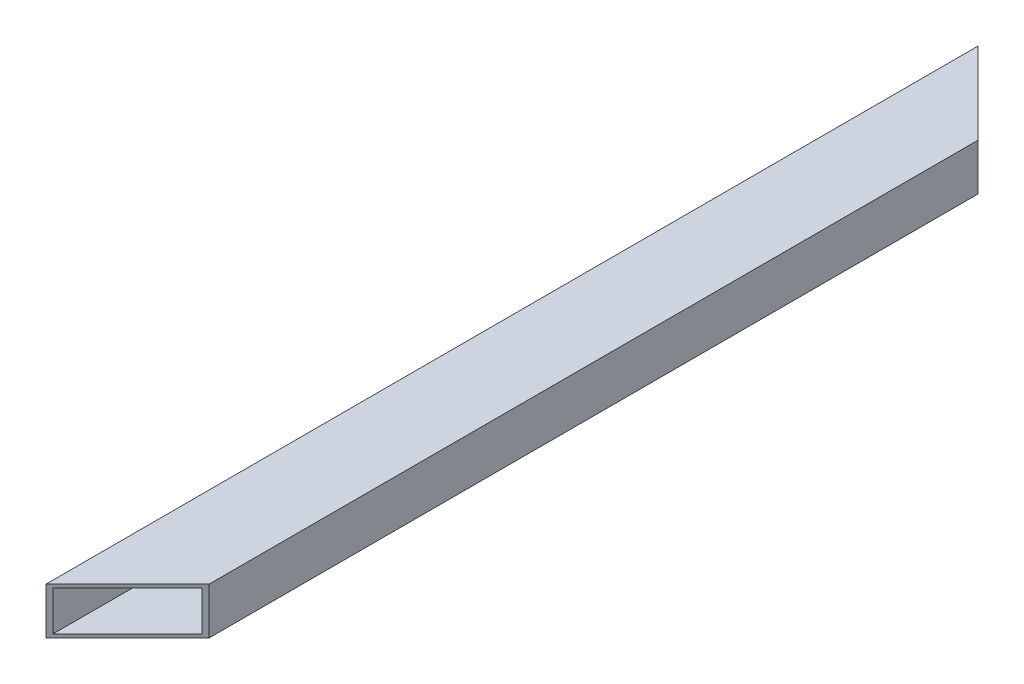
ISO-10303-21;
HEADER;
FILE_DESCRIPTION(('STEP AP214'),'2;1');
FILE_NAME('part.step','',(''),(''),'','','');
FILE_SCHEMA(('AUTOMOTIVE_DESIGN { 1 0 10303 214 1 1 1 1 }'));
ENDSEC;
DATA;
#1=APPLICATION_CONTEXT('core data for automotive mechanical design processes');
#2=APPLICATION_PROTOCOL_DEFINITION('international standard','automotive_design',2000,#1);
#3=PRODUCT_CONTEXT('',#1,'mechanical');
#4=PRODUCT('Part','Part','',(#3));
#5=PRODUCT_RELATED_PRODUCT_CATEGORY('part','',(#4));
#6=PRODUCT_DEFINITION_FORMATION('','',#4);
#7=PRODUCT_DEFINITION_CONTEXT('part definition',#1,'design');
#8=PRODUCT_DEFINITION('design','',#6,#7);
#9=PRODUCT_DEFINITION_SHAPE('','',#8);
#10=(LENGTH_UNIT() NAMED_UNIT(*) SI_UNIT(.MILLI.,.METRE.));
#11=(NAMED_UNIT(*) PLANE_ANGLE_UNIT() SI_UNIT($,.RADIAN.));
#12=(NAMED_UNIT(*) SI_UNIT($,.STERADIAN.) SOLID_ANGLE_UNIT());
#13=UNCERTAINTY_MEASURE_WITH_UNIT(LENGTH_MEASURE(1.E-05),#10,'distance_accuracy_value','');
#14=(GEOMETRIC_REPRESENTATION_CONTEXT(3) GLOBAL_UNCERTAINTY_ASSIGNED_CONTEXT((#13)) GLOBAL_UNIT_ASSIGNED_CONTEXT((#10,
#11,#12)) REPRESENTATION_CONTEXT('',''));
#15=CARTESIAN_POINT('',(0.,0.,0.));
#16=DIRECTION('',(0.,0.,1.));
#17=DIRECTION('',(1.,0.,0.));
#18=AXIS2_PLACEMENT_3D('',#15,#16,#17);
#19=CARTESIAN_POINT('',(0.,0.,400.));
#20=DIRECTION('',(0.,1.,0.));
#21=DIRECTION('',(0.,0.,1.));
#22=AXIS2_PLACEMENT_3D('',#19,#20,#21);
#23=PLANE('',#22);
#24=DIRECTION('',(0.707106781186556,0.,0.707106781186539));
#25=VECTOR('',#24,1.);
#26=CARTESIAN_POINT('',(0.,0.,0.));
#27=LINE('',#26,#25);
#28=CARTESIAN_POINT('',(0.,0.,0.));
#29=VERTEX_POINT('',#28);
#30=CARTESIAN_POINT('',(35.,0.,34.9999999999991));
#31=VERTEX_POINT('',#30);
#32=EDGE_CURVE('E102',#29,#31,#27,.T.);
#33=ORIENTED_EDGE('',*,*,#32,.T.);
#34=DIRECTION('',(0.,0.,-1.));
#35=VECTOR('',#34,1.);
#36=CARTESIAN_POINT('',(35.,0.,400.));
#37=LINE('',#36,#35);
#38=CARTESIAN_POINT('',(35.,0.,365.));
#39=VERTEX_POINT('',#38);
#40=EDGE_CURVE('E121',#39,#31,#37,.T.);
#41=ORIENTED_EDGE('',*,*,#40,.F.);
#42=DIRECTION('',(-0.707106781186546,0.,0.707106781186549));
#43=VECTOR('',#42,1.);
#44=CARTESIAN_POINT('',(0.,0.,400.));
#45=LINE('',#44,#43);
#46=CARTESIAN_POINT('',(0.,0.,400.));
#47=VERTEX_POINT('',#46);
#48=EDGE_CURVE('E129',#39,#47,#45,.T.);
#49=ORIENTED_EDGE('',*,*,#48,.T.);
#50=DIRECTION('',(0.,0.,-1.));
#51=VECTOR('',#50,1.);
#52=CARTESIAN_POINT('',(0.,0.,400.));
#53=LINE('',#52,#51);
#54=EDGE_CURVE('E40',#47,#29,#53,.T.);
#55=ORIENTED_EDGE('',*,*,#54,.T.);
#56=EDGE_LOOP('',(#33,#41,#49,#55));
#57=FACE_BOUND('',#56,.T.);
#58=ADVANCED_FACE('F32',(#57),#23,.F.);
#59=CARTESIAN_POINT('',(35.,0.,400.));
#60=DIRECTION('',(-1.,0.,0.));
#61=DIRECTION('',(0.,-1.,0.));
#62=AXIS2_PLACEMENT_3D('',#59,#60,#61);
#63=PLANE('',#62);
#64=DIRECTION('',(0.,-1.,0.));
#65=VECTOR('',#64,1.);
#66=CARTESIAN_POINT('',(35.,20.,34.9999999999991));
#67=LINE('',#66,#65);
#68=CARTESIAN_POINT('',(35.,20.,34.9999999999991));
#69=VERTEX_POINT('',#68);
#70=EDGE_CURVE('E118',#69,#31,#67,.T.);
#71=ORIENTED_EDGE('',*,*,#70,.F.);
#72=DIRECTION('',(0.,0.,-1.));
#73=VECTOR('',#72,1.);
#74=CARTESIAN_POINT('',(35.,20.,400.));
#75=LINE('',#74,#73);
#76=CARTESIAN_POINT('',(35.,20.,365.));
#77=VERTEX_POINT('',#76);
#78=EDGE_CURVE('E117',#77,#69,#75,.T.);
#79=ORIENTED_EDGE('',*,*,#78,.F.);
#80=DIRECTION('',(0.,-1.,0.));
#81=VECTOR('',#80,1.);
#82=CARTESIAN_POINT('',(35.,20.,365.));
#83=LINE('',#82,#81);
#84=EDGE_CURVE('E55',#77,#39,#83,.T.);
#85=ORIENTED_EDGE('',*,*,#84,.T.);
#86=ORIENTED_EDGE('',*,*,#40,.T.);
#87=EDGE_LOOP('',(#71,#79,#85,#86));
#88=FACE_BOUND('',#87,.T.);
#89=ADVANCED_FACE('F173',(#88),#63,.F.);
#90=CARTESIAN_POINT('',(0.,20.,400.));
#91=DIRECTION('',(0.,-1.,0.));
#92=DIRECTION('',(0.,0.,-1.));
#93=AXIS2_PLACEMENT_3D('',#90,#91,#92);
#94=PLANE('',#93);
#95=DIRECTION('',(0.707106781186556,0.,0.707106781186539));
#96=VECTOR('',#95,1.);
#97=CARTESIAN_POINT('',(0.,20.,0.));
#98=LINE('',#97,#96);
#99=CARTESIAN_POINT('',(0.,20.,0.));
#100=VERTEX_POINT('',#99);
#101=EDGE_CURVE('E99',#100,#69,#98,.T.);
#102=ORIENTED_EDGE('',*,*,#101,.F.);
#103=DIRECTION('',(0.,0.,-1.));
#104=VECTOR('',#103,1.);
#105=CARTESIAN_POINT('',(0.,20.,400.));
#106=LINE('',#105,#104);
#107=CARTESIAN_POINT('',(0.,20.,400.));
#108=VERTEX_POINT('',#107);
#109=EDGE_CURVE('E114',#108,#100,#106,.T.);
#110=ORIENTED_EDGE('',*,*,#109,.F.);
#111=DIRECTION('',(-0.707106781186546,0.,0.707106781186549));
#112=VECTOR('',#111,1.);
#113=CARTESIAN_POINT('',(0.,20.,400.));
#114=LINE('',#113,#112);
#115=EDGE_CURVE('E130',#77,#108,#114,.T.);
#116=ORIENTED_EDGE('',*,*,#115,.F.);
#117=ORIENTED_EDGE('',*,*,#78,.T.);
#118=EDGE_LOOP('',(#102,#110,#116,#117));
#119=FACE_BOUND('',#118,.T.);
#120=ADVANCED_FACE('F113',(#119),#94,.F.);
#121=CARTESIAN_POINT('',(1.5,18.5,400.));
#122=DIRECTION('',(1.,0.,0.));
#123=DIRECTION('',(0.,1.,0.));
#124=AXIS2_PLACEMENT_3D('',#121,#122,#123);
#125=PLANE('',#124);
#126=DIRECTION('',(0.,0.,-1.));
#127=VECTOR('',#126,1.);
#128=CARTESIAN_POINT('',(1.5,1.5,400.));
#129=LINE('',#128,#127);
#130=CARTESIAN_POINT('',(1.5,1.5,398.5));
#131=VERTEX_POINT('',#130);
#132=CARTESIAN_POINT('',(1.50000000000003,1.5,1.50000000000003));
#133=VERTEX_POINT('',#132);
#134=EDGE_CURVE('E108',#131,#133,#129,.T.);
#135=ORIENTED_EDGE('',*,*,#134,.T.);
#136=DIRECTION('',(0.,1.,0.));
#137=VECTOR('',#136,1.);
#138=CARTESIAN_POINT('',(1.5,18.4999999999999,1.49999999999995));
#139=LINE('',#138,#137);
#140=CARTESIAN_POINT('',(1.50000000000003,18.5,1.50000000000003));
#141=VERTEX_POINT('',#140);
#142=EDGE_CURVE('E131',#133,#141,#139,.T.);
#143=ORIENTED_EDGE('',*,*,#142,.T.);
#144=DIRECTION('',(0.,0.,-1.));
#145=VECTOR('',#144,1.);
#146=CARTESIAN_POINT('',(1.5,18.5,400.));
#147=LINE('',#146,#145);
#148=CARTESIAN_POINT('',(1.5,18.5,398.5));
#149=VERTEX_POINT('',#148);
#150=EDGE_CURVE('E148',#149,#141,#147,.T.);
#151=ORIENTED_EDGE('',*,*,#150,.F.);
#152=DIRECTION('',(0.,-1.,0.));
#153=VECTOR('',#152,1.);
#154=CARTESIAN_POINT('',(1.5,18.5,398.5));
#155=LINE('',#154,#153);
#156=EDGE_CURVE('E145',#149,#131,#155,.T.);
#157=ORIENTED_EDGE('',*,*,#156,.T.);
#158=EDGE_LOOP('',(#135,#143,#151,#157));
#159=FACE_BOUND('',#158,.T.);
#160=ADVANCED_FACE('F160',(#159),#125,.T.);
#161=CARTESIAN_POINT('',(1.5,1.5,400.));
#162=DIRECTION('',(0.,1.,0.));
#163=DIRECTION('',(0.,0.,1.));
#164=AXIS2_PLACEMENT_3D('',#161,#162,#163);
#165=PLANE('',#164);
#166=DIRECTION('',(0.,0.,-1.));
#167=VECTOR('',#166,1.);
#168=CARTESIAN_POINT('',(33.5,1.5,400.));
#169=LINE('',#168,#167);
#170=CARTESIAN_POINT('',(33.5,1.5,366.5));
#171=VERTEX_POINT('',#170);
#172=CARTESIAN_POINT('',(33.5,1.5,33.4999999999992));
#173=VERTEX_POINT('',#172);
#174=EDGE_CURVE('E154',#171,#173,#169,.T.);
#175=ORIENTED_EDGE('',*,*,#174,.T.);
#176=DIRECTION('',(-0.707106781186556,0.,-0.707106781186539));
#177=VECTOR('',#176,1.);
#178=CARTESIAN_POINT('',(200.75,1.5,200.749999999995));
#179=LINE('',#178,#177);
#180=EDGE_CURVE('E135',#173,#133,#179,.T.);
#181=ORIENTED_EDGE('',*,*,#180,.T.);
#182=ORIENTED_EDGE('',*,*,#134,.F.);
#183=DIRECTION('',(0.707106781186546,0.,-0.707106781186549));
#184=VECTOR('',#183,1.);
#185=CARTESIAN_POINT('',(0.749999999999991,1.5,399.25));
#186=LINE('',#185,#184);
#187=EDGE_CURVE('E142',#131,#171,#186,.T.);
#188=ORIENTED_EDGE('',*,*,#187,.T.);
#189=EDGE_LOOP('',(#175,#181,#182,#188));
#190=FACE_BOUND('',#189,.T.);
#191=ADVANCED_FACE('F164',(#190),#165,.T.);
#192=CARTESIAN_POINT('',(33.5,18.5,400.));
#193=DIRECTION('',(-1.,0.,0.));
#194=DIRECTION('',(0.,0.,1.));
#195=AXIS2_PLACEMENT_3D('',#192,#193,#194);
#196=PLANE('',#195);
#197=DIRECTION('',(0.,0.,-1.));
#198=VECTOR('',#197,1.);
#199=CARTESIAN_POINT('',(33.5,18.5,400.));
#200=LINE('',#199,#198);
#201=CARTESIAN_POINT('',(33.5,18.5,366.5));
#202=VERTEX_POINT('',#201);
#203=CARTESIAN_POINT('',(33.5,18.5,33.4999999999993));
#204=VERTEX_POINT('',#203);
#205=EDGE_CURVE('E151',#202,#204,#200,.T.);
#206=ORIENTED_EDGE('',*,*,#205,.T.);
#207=DIRECTION('',(0.,-1.,0.));
#208=VECTOR('',#207,1.);
#209=CARTESIAN_POINT('',(33.5,18.5,33.4999999999992));
#210=LINE('',#209,#208);
#211=EDGE_CURVE('E47',#204,#173,#210,.T.);
#212=ORIENTED_EDGE('',*,*,#211,.T.);
#213=ORIENTED_EDGE('',*,*,#174,.F.);
#214=DIRECTION('',(0.,1.,0.));
#215=VECTOR('',#214,1.);
#216=CARTESIAN_POINT('',(33.5,18.5,366.5));
#217=LINE('',#216,#215);
#218=EDGE_CURVE('E139',#171,#202,#217,.T.);
#219=ORIENTED_EDGE('',*,*,#218,.T.);
#220=EDGE_LOOP('',(#206,#212,#213,#219));
#221=FACE_BOUND('',#220,.T.);
#222=ADVANCED_FACE('F186',(#221),#196,.T.);
#223=CARTESIAN_POINT('',(1.5,18.5,400.));
#224=DIRECTION('',(0.,-1.,0.));
#225=DIRECTION('',(0.,0.,-1.));
#226=AXIS2_PLACEMENT_3D('',#223,#224,#225);
#227=PLANE('',#226);
#228=ORIENTED_EDGE('',*,*,#150,.T.);
#229=DIRECTION('',(0.707106781186556,0.,0.707106781186539));
#230=VECTOR('',#229,1.);
#231=CARTESIAN_POINT('',(200.75,18.5,200.749999999995));
#232=LINE('',#231,#230);
#233=EDGE_CURVE('E167',#141,#204,#232,.T.);
#234=ORIENTED_EDGE('',*,*,#233,.T.);
#235=ORIENTED_EDGE('',*,*,#205,.F.);
#236=DIRECTION('',(-0.707106781186546,0.,0.707106781186549));
#237=VECTOR('',#236,1.);
#238=CARTESIAN_POINT('',(0.74999999999999,18.5,399.25));
#239=LINE('',#238,#237);
#240=EDGE_CURVE('E11',#202,#149,#239,.T.);
#241=ORIENTED_EDGE('',*,*,#240,.T.);
#242=EDGE_LOOP('',(#228,#234,#235,#241));
#243=FACE_BOUND('',#242,.T.);
#244=ADVANCED_FACE('F189',(#243),#227,.T.);
#245=CARTESIAN_POINT('',(0.,0.,400.));
#246=DIRECTION('',(1.,0.,0.));
#247=DIRECTION('',(0.,1.,0.));
#248=AXIS2_PLACEMENT_3D('',#245,#246,#247);
#249=PLANE('',#248);
#250=DIRECTION('',(0.,-1.,0.));
#251=VECTOR('',#250,1.);
#252=CARTESIAN_POINT('',(0.,0.,0.));
#253=LINE('',#252,#251);
#254=EDGE_CURVE('E96',#100,#29,#253,.T.);
#255=ORIENTED_EDGE('',*,*,#254,.T.);
#256=ORIENTED_EDGE('',*,*,#54,.F.);
#257=DIRECTION('',(0.,-1.,0.));
#258=VECTOR('',#257,1.);
#259=CARTESIAN_POINT('',(0.,0.,400.));
#260=LINE('',#259,#258);
#261=EDGE_CURVE('E107',#108,#47,#260,.T.);
#262=ORIENTED_EDGE('',*,*,#261,.F.);
#263=ORIENTED_EDGE('',*,*,#109,.T.);
#264=EDGE_LOOP('',(#255,#256,#262,#263));
#265=FACE_BOUND('',#264,.T.);
#266=ADVANCED_FACE('F34',(#265),#249,.F.);
#267=CARTESIAN_POINT('',(0.,20.,400.));
#268=DIRECTION('',(0.707106781186549,0.,0.707106781186546));
#269=DIRECTION('',(0.707106781186546,0.,-0.707106781186549));
#270=AXIS2_PLACEMENT_3D('',#267,#268,#269);
#271=PLANE('',#270);
#272=ORIENTED_EDGE('',*,*,#240,.F.);
#273=ORIENTED_EDGE('',*,*,#218,.F.);
#274=ORIENTED_EDGE('',*,*,#187,.F.);
#275=ORIENTED_EDGE('',*,*,#156,.F.);
#276=EDGE_LOOP('',(#272,#273,#274,#275));
#277=FACE_BOUND('',#276,.T.);
#278=ORIENTED_EDGE('',*,*,#48,.F.);
#279=ORIENTED_EDGE('',*,*,#84,.F.);
#280=ORIENTED_EDGE('',*,*,#115,.T.);
#281=ORIENTED_EDGE('',*,*,#261,.T.);
#282=EDGE_LOOP('',(#278,#279,#280,#281));
#283=FACE_BOUND('',#282,.T.);
#284=ADVANCED_FACE('F194',(#277,#283),#271,.T.);
#285=CARTESIAN_POINT('',(0.,20.,0.));
#286=DIRECTION('',(0.707106781186539,0.,-0.707106781186556));
#287=DIRECTION('',(-0.707106781186556,0.,-0.707106781186539));
#288=AXIS2_PLACEMENT_3D('',#285,#286,#287);
#289=PLANE('',#288);
#290=ORIENTED_EDGE('',*,*,#180,.F.);
#291=ORIENTED_EDGE('',*,*,#211,.F.);
#292=ORIENTED_EDGE('',*,*,#233,.F.);
#293=ORIENTED_EDGE('',*,*,#142,.F.);
#294=EDGE_LOOP('',(#290,#291,#292,#293));
#295=FACE_BOUND('',#294,.T.);
#296=ORIENTED_EDGE('',*,*,#32,.F.);
#297=ORIENTED_EDGE('',*,*,#254,.F.);
#298=ORIENTED_EDGE('',*,*,#101,.T.);
#299=ORIENTED_EDGE('',*,*,#70,.T.);
#300=EDGE_LOOP('',(#296,#297,#298,#299));
#301=FACE_BOUND('',#300,.T.);
#302=ADVANCED_FACE('F98',(#295,#301),#289,.T.);
#303=CLOSED_SHELL('',(#58,#89,#120,#160,#191,#222,#244,#266,#284,#302));
#304=MANIFOLD_SOLID_BREP('B2',#303);
#305=ADVANCED_BREP_SHAPE_REPRESENTATION('',(#18,#304),#14);
#306=SHAPE_DEFINITION_REPRESENTATION(#9,#305);
ENDSEC;
END-ISO-10303-21;
